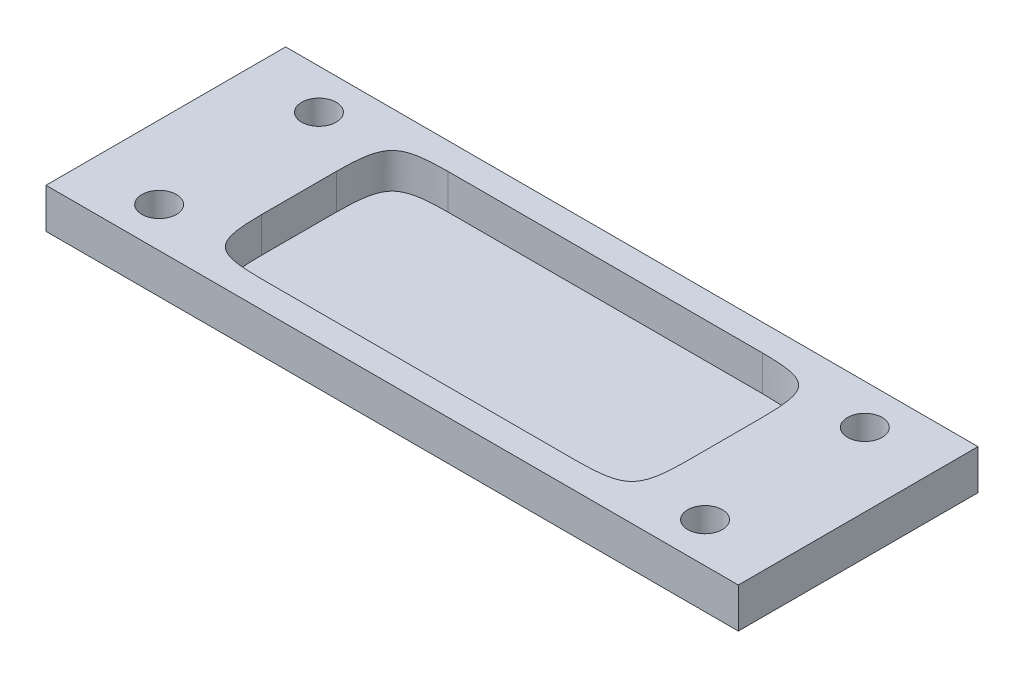
ISO-10303-21;
HEADER;
FILE_DESCRIPTION(('STEP AP214'),'2;1');
FILE_NAME('part.step','',(''),(''),'','','');
FILE_SCHEMA(('AUTOMOTIVE_DESIGN { 1 0 10303 214 1 1 1 1 }'));
ENDSEC;
DATA;
#1=APPLICATION_CONTEXT('core data for automotive mechanical design processes');
#2=APPLICATION_PROTOCOL_DEFINITION('international standard','automotive_design',2000,#1);
#3=PRODUCT_CONTEXT('',#1,'mechanical');
#4=PRODUCT('Part','Part','',(#3));
#5=PRODUCT_RELATED_PRODUCT_CATEGORY('part','',(#4));
#6=PRODUCT_DEFINITION_FORMATION('','',#4);
#7=PRODUCT_DEFINITION_CONTEXT('part definition',#1,'design');
#8=PRODUCT_DEFINITION('design','',#6,#7);
#9=PRODUCT_DEFINITION_SHAPE('','',#8);
#10=(LENGTH_UNIT() NAMED_UNIT(*) SI_UNIT(.MILLI.,.METRE.));
#11=(NAMED_UNIT(*) PLANE_ANGLE_UNIT() SI_UNIT($,.RADIAN.));
#12=(NAMED_UNIT(*) SI_UNIT($,.STERADIAN.) SOLID_ANGLE_UNIT());
#13=UNCERTAINTY_MEASURE_WITH_UNIT(LENGTH_MEASURE(1.E-05),#10,'distance_accuracy_value','');
#14=(GEOMETRIC_REPRESENTATION_CONTEXT(3) GLOBAL_UNCERTAINTY_ASSIGNED_CONTEXT((#13)) GLOBAL_UNIT_ASSIGNED_CONTEXT((#10,
#11,#12)) REPRESENTATION_CONTEXT('',''));
#15=CARTESIAN_POINT('',(0.,0.,0.));
#16=DIRECTION('',(0.,0.,1.));
#17=DIRECTION('',(1.,0.,0.));
#18=AXIS2_PLACEMENT_3D('',#15,#16,#17);
#19=CARTESIAN_POINT('',(26.0000000000002,3.,-8.9999999999999));
#20=DIRECTION('',(-1.,0.,0.));
#21=DIRECTION('',(0.,0.,1.));
#22=AXIS2_PLACEMENT_3D('',#19,#20,#21);
#23=PLANE('',#22);
#24=DIRECTION('',(0.,0.,-1.));
#25=VECTOR('',#24,1.);
#26=CARTESIAN_POINT('',(26.0000000000002,0.,-8.9999999999999));
#27=LINE('',#26,#25);
#28=CARTESIAN_POINT('',(26.0000000000002,0.,9.00000000000012));
#29=VERTEX_POINT('',#28);
#30=CARTESIAN_POINT('',(26.0000000000002,0.,-8.9999999999999));
#31=VERTEX_POINT('',#30);
#32=EDGE_CURVE('E170',#29,#31,#27,.T.);
#33=ORIENTED_EDGE('',*,*,#32,.T.);
#34=DIRECTION('',(0.,-1.,0.));
#35=VECTOR('',#34,1.);
#36=CARTESIAN_POINT('',(26.0000000000002,3.,-8.9999999999999));
#37=LINE('',#36,#35);
#38=CARTESIAN_POINT('',(26.0000000000002,3.,-8.9999999999999));
#39=VERTEX_POINT('',#38);
#40=EDGE_CURVE('E149',#39,#31,#37,.T.);
#41=ORIENTED_EDGE('',*,*,#40,.F.);
#42=DIRECTION('',(0.,0.,-1.));
#43=VECTOR('',#42,1.);
#44=CARTESIAN_POINT('',(26.0000000000002,3.,-8.9999999999999));
#45=LINE('',#44,#43);
#46=CARTESIAN_POINT('',(26.0000000000002,3.,9.00000000000012));
#47=VERTEX_POINT('',#46);
#48=EDGE_CURVE('E157',#47,#39,#45,.T.);
#49=ORIENTED_EDGE('',*,*,#48,.F.);
#50=DIRECTION('',(0.,-1.,0.));
#51=VECTOR('',#50,1.);
#52=CARTESIAN_POINT('',(26.0000000000002,3.,9.00000000000012));
#53=LINE('',#52,#51);
#54=EDGE_CURVE('E200',#47,#29,#53,.T.);
#55=ORIENTED_EDGE('',*,*,#54,.T.);
#56=EDGE_LOOP('',(#33,#41,#49,#55));
#57=FACE_BOUND('',#56,.T.);
#58=ADVANCED_FACE('F48',(#57),#23,.F.);
#59=CARTESIAN_POINT('',(-25.9999999999998,3.,-8.9999999999999));
#60=DIRECTION('',(0.,0.,1.));
#61=DIRECTION('',(1.,0.,0.));
#62=AXIS2_PLACEMENT_3D('',#59,#60,#61);
#63=PLANE('',#62);
#64=DIRECTION('',(-1.,0.,0.));
#65=VECTOR('',#64,1.);
#66=CARTESIAN_POINT('',(-25.9999999999998,0.,-8.9999999999999));
#67=LINE('',#66,#65);
#68=CARTESIAN_POINT('',(-25.9999999999998,0.,-8.9999999999999));
#69=VERTEX_POINT('',#68);
#70=EDGE_CURVE('E203',#31,#69,#67,.T.);
#71=ORIENTED_EDGE('',*,*,#70,.T.);
#72=DIRECTION('',(0.,-1.,0.));
#73=VECTOR('',#72,1.);
#74=CARTESIAN_POINT('',(-25.9999999999998,3.,-8.9999999999999));
#75=LINE('',#74,#73);
#76=CARTESIAN_POINT('',(-25.9999999999998,3.,-8.9999999999999));
#77=VERTEX_POINT('',#76);
#78=EDGE_CURVE('E152',#77,#69,#75,.T.);
#79=ORIENTED_EDGE('',*,*,#78,.F.);
#80=DIRECTION('',(-1.,0.,0.));
#81=VECTOR('',#80,1.);
#82=CARTESIAN_POINT('',(-25.9999999999998,3.,-8.9999999999999));
#83=LINE('',#82,#81);
#84=EDGE_CURVE('E145',#39,#77,#83,.T.);
#85=ORIENTED_EDGE('',*,*,#84,.F.);
#86=ORIENTED_EDGE('',*,*,#40,.T.);
#87=EDGE_LOOP('',(#71,#79,#85,#86));
#88=FACE_BOUND('',#87,.T.);
#89=ADVANCED_FACE('F147',(#88),#63,.F.);
#90=CARTESIAN_POINT('',(-25.9999999999998,3.,-8.9999999999999));
#91=DIRECTION('',(1.,0.,0.));
#92=DIRECTION('',(0.,0.,-1.));
#93=AXIS2_PLACEMENT_3D('',#90,#91,#92);
#94=PLANE('',#93);
#95=DIRECTION('',(0.,0.,1.));
#96=VECTOR('',#95,1.);
#97=CARTESIAN_POINT('',(-25.9999999999998,0.,-8.9999999999999));
#98=LINE('',#97,#96);
#99=CARTESIAN_POINT('',(-25.9999999999998,0.,9.00000000000012));
#100=VERTEX_POINT('',#99);
#101=EDGE_CURVE('E206',#69,#100,#98,.T.);
#102=ORIENTED_EDGE('',*,*,#101,.T.);
#103=DIRECTION('',(0.,-1.,0.));
#104=VECTOR('',#103,1.);
#105=CARTESIAN_POINT('',(-25.9999999999998,3.,9.00000000000012));
#106=LINE('',#105,#104);
#107=CARTESIAN_POINT('',(-25.9999999999998,3.,9.00000000000012));
#108=VERTEX_POINT('',#107);
#109=EDGE_CURVE('E177',#108,#100,#106,.T.);
#110=ORIENTED_EDGE('',*,*,#109,.F.);
#111=DIRECTION('',(0.,0.,1.));
#112=VECTOR('',#111,1.);
#113=CARTESIAN_POINT('',(-25.9999999999998,3.,-8.9999999999999));
#114=LINE('',#113,#112);
#115=EDGE_CURVE('E156',#77,#108,#114,.T.);
#116=ORIENTED_EDGE('',*,*,#115,.F.);
#117=ORIENTED_EDGE('',*,*,#78,.T.);
#118=EDGE_LOOP('',(#102,#110,#116,#117));
#119=FACE_BOUND('',#118,.T.);
#120=ADVANCED_FACE('F222',(#119),#94,.F.);
#121=CARTESIAN_POINT('',(-25.9999999999998,3.,9.00000000000012));
#122=DIRECTION('',(0.,0.,-1.));
#123=DIRECTION('',(-1.,0.,0.));
#124=AXIS2_PLACEMENT_3D('',#121,#122,#123);
#125=PLANE('',#124);
#126=DIRECTION('',(1.,0.,0.));
#127=VECTOR('',#126,1.);
#128=CARTESIAN_POINT('',(-25.9999999999998,0.,9.00000000000012));
#129=LINE('',#128,#127);
#130=EDGE_CURVE('E167',#100,#29,#129,.T.);
#131=ORIENTED_EDGE('',*,*,#130,.T.);
#132=ORIENTED_EDGE('',*,*,#54,.F.);
#133=DIRECTION('',(1.,0.,0.));
#134=VECTOR('',#133,1.);
#135=CARTESIAN_POINT('',(-25.9999999999998,3.,9.00000000000012));
#136=LINE('',#135,#134);
#137=EDGE_CURVE('E162',#108,#47,#136,.T.);
#138=ORIENTED_EDGE('',*,*,#137,.F.);
#139=ORIENTED_EDGE('',*,*,#109,.T.);
#140=EDGE_LOOP('',(#131,#132,#138,#139));
#141=FACE_BOUND('',#140,.T.);
#142=ADVANCED_FACE('F217',(#141),#125,.F.);
#143=CARTESIAN_POINT('',(0.,3.,0.));
#144=DIRECTION('',(0.,1.,0.));
#145=DIRECTION('',(0.,0.,1.));
#146=AXIS2_PLACEMENT_3D('',#143,#144,#145);
#147=PLANE('',#146);
#148=CARTESIAN_POINT('',(-20.4999999999998,3.,-5.99999999999988));
#149=DIRECTION('',(0.,1.,0.));
#150=DIRECTION('',(0.,0.,1.));
#151=AXIS2_PLACEMENT_3D('',#148,#149,#150);
#152=CIRCLE('',#151,1.3);
#153=CARTESIAN_POINT('',(-20.4999999999998,3.,-4.69999999999988));
#154=VERTEX_POINT('',#153);
#155=EDGE_CURVE('E544',#154,#154,#152,.T.);
#156=ORIENTED_EDGE('',*,*,#155,.F.);
#157=EDGE_LOOP('',(#156));
#158=FACE_BOUND('',#157,.T.);
#159=CARTESIAN_POINT('',(-20.4999999999998,3.,6.00000000000012));
#160=DIRECTION('',(0.,1.,0.));
#161=DIRECTION('',(0.,0.,1.));
#162=AXIS2_PLACEMENT_3D('',#159,#160,#161);
#163=CIRCLE('',#162,1.3);
#164=CARTESIAN_POINT('',(-20.4999999999998,3.,7.30000000000012));
#165=VERTEX_POINT('',#164);
#166=EDGE_CURVE('E548',#165,#165,#163,.T.);
#167=ORIENTED_EDGE('',*,*,#166,.F.);
#168=EDGE_LOOP('',(#167));
#169=FACE_BOUND('',#168,.T.);
#170=CARTESIAN_POINT('',(20.5000000000002,3.,-5.99999999999988));
#171=DIRECTION('',(0.,1.,0.));
#172=DIRECTION('',(0.,0.,1.));
#173=AXIS2_PLACEMENT_3D('',#170,#171,#172);
#174=CIRCLE('',#173,1.3);
#175=CARTESIAN_POINT('',(20.5000000000002,3.,-4.69999999999988));
#176=VERTEX_POINT('',#175);
#177=EDGE_CURVE('E552',#176,#176,#174,.T.);
#178=ORIENTED_EDGE('',*,*,#177,.F.);
#179=EDGE_LOOP('',(#178));
#180=FACE_BOUND('',#179,.T.);
#181=CARTESIAN_POINT('',(20.5000000000002,3.,6.00000000000012));
#182=DIRECTION('',(0.,1.,0.));
#183=DIRECTION('',(0.,0.,1.));
#184=AXIS2_PLACEMENT_3D('',#181,#182,#183);
#185=CIRCLE('',#184,1.3);
#186=CARTESIAN_POINT('',(20.5000000000002,3.,7.30000000000012));
#187=VERTEX_POINT('',#186);
#188=EDGE_CURVE('E555',#187,#187,#185,.T.);
#189=ORIENTED_EDGE('',*,*,#188,.F.);
#190=EDGE_LOOP('',(#189));
#191=FACE_BOUND('',#190,.T.);
#192=DIRECTION('',(0.,0.,-1.));
#193=VECTOR('',#192,1.);
#194=CARTESIAN_POINT('',(16.,3.,-7.));
#195=LINE('',#194,#193);
#196=CARTESIAN_POINT('',(16.,3.,2.8));
#197=VERTEX_POINT('',#196);
#198=CARTESIAN_POINT('',(16.,3.,-2.8));
#199=VERTEX_POINT('',#198);
#200=EDGE_CURVE('E454',#197,#199,#195,.T.);
#201=ORIENTED_EDGE('',*,*,#200,.F.);
#202=CARTESIAN_POINT('',(11.8,3.,7.));
#203=CARTESIAN_POINT('',(16.,3.,7.));
#204=CARTESIAN_POINT('',(16.,3.,2.8));
#205=(BOUNDED_CURVE() B_SPLINE_CURVE(2,(#202,#203,#204),.UNSPECIFIED.,.F.,
.F.) B_SPLINE_CURVE_WITH_KNOTS((3,3),(0.,1.),
.UNSPECIFIED.) CURVE() GEOMETRIC_REPRESENTATION_ITEM() RATIONAL_B_SPLINE_CURVE((1.,
1.85714285714286,1.)) REPRESENTATION_ITEM(''));
#206=CARTESIAN_POINT('',(11.8,3.,7.));
#207=VERTEX_POINT('',#206);
#208=EDGE_CURVE('E12',#197,#207,#205,.F.);
#209=ORIENTED_EDGE('',*,*,#208,.T.);
#210=DIRECTION('',(1.,0.,0.));
#211=VECTOR('',#210,1.);
#212=CARTESIAN_POINT('',(-16.,3.,7.));
#213=LINE('',#212,#211);
#214=CARTESIAN_POINT('',(-11.8,3.,7.));
#215=VERTEX_POINT('',#214);
#216=EDGE_CURVE('E181',#215,#207,#213,.T.);
#217=ORIENTED_EDGE('',*,*,#216,.F.);
#218=CARTESIAN_POINT('',(-16.,3.,2.8));
#219=CARTESIAN_POINT('',(-16.,3.,7.));
#220=CARTESIAN_POINT('',(-11.8,3.,7.));
#221=(BOUNDED_CURVE() B_SPLINE_CURVE(2,(#218,#219,#220),.UNSPECIFIED.,.F.,
.F.) B_SPLINE_CURVE_WITH_KNOTS((3,3),(0.,1.),
.UNSPECIFIED.) CURVE() GEOMETRIC_REPRESENTATION_ITEM() RATIONAL_B_SPLINE_CURVE((1.,
1.85714285714286,1.)) REPRESENTATION_ITEM(''));
#222=CARTESIAN_POINT('',(-16.,3.,2.8));
#223=VERTEX_POINT('',#222);
#224=EDGE_CURVE('E496',#215,#223,#221,.F.);
#225=ORIENTED_EDGE('',*,*,#224,.T.);
#226=DIRECTION('',(0.,0.,1.));
#227=VECTOR('',#226,1.);
#228=CARTESIAN_POINT('',(-16.,3.,-7.));
#229=LINE('',#228,#227);
#230=CARTESIAN_POINT('',(-16.,3.,-2.8));
#231=VERTEX_POINT('',#230);
#232=EDGE_CURVE('E187',#231,#223,#229,.T.);
#233=ORIENTED_EDGE('',*,*,#232,.F.);
#234=CARTESIAN_POINT('',(-11.8,3.,-7.));
#235=CARTESIAN_POINT('',(-16.,3.,-7.));
#236=CARTESIAN_POINT('',(-16.,3.,-2.8));
#237=(BOUNDED_CURVE() B_SPLINE_CURVE(2,(#234,#235,#236),.UNSPECIFIED.,.F.,
.F.) B_SPLINE_CURVE_WITH_KNOTS((3,3),(0.,1.),
.UNSPECIFIED.) CURVE() GEOMETRIC_REPRESENTATION_ITEM() RATIONAL_B_SPLINE_CURVE((1.,
1.85714285714286,1.)) REPRESENTATION_ITEM(''));
#238=CARTESIAN_POINT('',(-11.8,3.,-7.));
#239=VERTEX_POINT('',#238);
#240=EDGE_CURVE('E294',#231,#239,#237,.F.);
#241=ORIENTED_EDGE('',*,*,#240,.T.);
#242=DIRECTION('',(-1.,0.,0.));
#243=VECTOR('',#242,1.);
#244=CARTESIAN_POINT('',(-16.,3.,-7.));
#245=LINE('',#244,#243);
#246=CARTESIAN_POINT('',(11.8,3.,-7.));
#247=VERTEX_POINT('',#246);
#248=EDGE_CURVE('E458',#247,#239,#245,.T.);
#249=ORIENTED_EDGE('',*,*,#248,.F.);
#250=CARTESIAN_POINT('',(16.,3.,-2.8));
#251=CARTESIAN_POINT('',(16.,3.,-7.));
#252=CARTESIAN_POINT('',(11.8,3.,-7.));
#253=(BOUNDED_CURVE() B_SPLINE_CURVE(2,(#250,#251,#252),.UNSPECIFIED.,.F.,
.F.) B_SPLINE_CURVE_WITH_KNOTS((3,3),(0.,1.),
.UNSPECIFIED.) CURVE() GEOMETRIC_REPRESENTATION_ITEM() RATIONAL_B_SPLINE_CURVE((1.,
1.85714285714286,1.)) REPRESENTATION_ITEM(''));
#254=EDGE_CURVE('E63',#247,#199,#253,.F.);
#255=ORIENTED_EDGE('',*,*,#254,.T.);
#256=EDGE_LOOP('',(#201,#209,#217,#225,#233,#241,#249,#255));
#257=FACE_BOUND('',#256,.T.);
#258=ORIENTED_EDGE('',*,*,#48,.T.);
#259=ORIENTED_EDGE('',*,*,#84,.T.);
#260=ORIENTED_EDGE('',*,*,#115,.T.);
#261=ORIENTED_EDGE('',*,*,#137,.T.);
#262=EDGE_LOOP('',(#258,#259,#260,#261));
#263=FACE_BOUND('',#262,.T.);
#264=ADVANCED_FACE('F160',(#158,#169,#180,#191,#257,#263),#147,.T.);
#265=CARTESIAN_POINT('',(0.,0.,0.));
#266=DIRECTION('',(0.,1.,0.));
#267=DIRECTION('',(0.,0.,1.));
#268=AXIS2_PLACEMENT_3D('',#265,#266,#267);
#269=PLANE('',#268);
#270=CARTESIAN_POINT('',(-20.4999999999998,0.,-5.99999999999988));
#271=DIRECTION('',(0.,1.,0.));
#272=DIRECTION('',(0.,0.,1.));
#273=AXIS2_PLACEMENT_3D('',#270,#271,#272);
#274=CIRCLE('',#273,1.3);
#275=CARTESIAN_POINT('',(-20.4999999999998,0.,-4.69999999999988));
#276=VERTEX_POINT('',#275);
#277=EDGE_CURVE('E814',#276,#276,#274,.T.);
#278=ORIENTED_EDGE('',*,*,#277,.T.);
#279=EDGE_LOOP('',(#278));
#280=FACE_BOUND('',#279,.T.);
#281=CARTESIAN_POINT('',(-20.4999999999998,0.,6.00000000000012));
#282=DIRECTION('',(0.,1.,0.));
#283=DIRECTION('',(0.,0.,1.));
#284=AXIS2_PLACEMENT_3D('',#281,#282,#283);
#285=CIRCLE('',#284,1.3);
#286=CARTESIAN_POINT('',(-20.4999999999998,0.,7.30000000000012));
#287=VERTEX_POINT('',#286);
#288=EDGE_CURVE('E822',#287,#287,#285,.T.);
#289=ORIENTED_EDGE('',*,*,#288,.T.);
#290=EDGE_LOOP('',(#289));
#291=FACE_BOUND('',#290,.T.);
#292=CARTESIAN_POINT('',(20.5000000000002,0.,-5.99999999999988));
#293=DIRECTION('',(0.,1.,0.));
#294=DIRECTION('',(0.,0.,1.));
#295=AXIS2_PLACEMENT_3D('',#292,#293,#294);
#296=CIRCLE('',#295,1.3);
#297=CARTESIAN_POINT('',(20.5000000000002,0.,-4.69999999999988));
#298=VERTEX_POINT('',#297);
#299=EDGE_CURVE('E558',#298,#298,#296,.T.);
#300=ORIENTED_EDGE('',*,*,#299,.T.);
#301=EDGE_LOOP('',(#300));
#302=FACE_BOUND('',#301,.T.);
#303=CARTESIAN_POINT('',(20.5000000000002,0.,6.00000000000012));
#304=DIRECTION('',(0.,1.,0.));
#305=DIRECTION('',(0.,0.,1.));
#306=AXIS2_PLACEMENT_3D('',#303,#304,#305);
#307=CIRCLE('',#306,1.3);
#308=CARTESIAN_POINT('',(20.5000000000002,0.,7.30000000000012));
#309=VERTEX_POINT('',#308);
#310=EDGE_CURVE('E459',#309,#309,#307,.T.);
#311=ORIENTED_EDGE('',*,*,#310,.T.);
#312=EDGE_LOOP('',(#311));
#313=FACE_BOUND('',#312,.T.);
#314=ORIENTED_EDGE('',*,*,#32,.F.);
#315=ORIENTED_EDGE('',*,*,#130,.F.);
#316=ORIENTED_EDGE('',*,*,#101,.F.);
#317=ORIENTED_EDGE('',*,*,#70,.F.);
#318=EDGE_LOOP('',(#314,#315,#316,#317));
#319=FACE_BOUND('',#318,.T.);
#320=ADVANCED_FACE('F221',(#280,#291,#302,#313,#319),#269,.F.);
#321=CARTESIAN_POINT('',(16.,0.35,-7.));
#322=DIRECTION('',(1.,0.,0.));
#323=DIRECTION('',(0.,0.,-1.));
#324=AXIS2_PLACEMENT_3D('',#321,#322,#323);
#325=PLANE('',#324);
#326=ORIENTED_EDGE('',*,*,#200,.T.);
#327=CARTESIAN_POINT('',(16.,0.2175,-2.8));
#328=CARTESIAN_POINT('',(16.,1.18916666666667,-2.8));
#329=CARTESIAN_POINT('',(16.,2.16083333333333,-2.8));
#330=CARTESIAN_POINT('',(16.,3.1325,-2.8));
#331=(BOUNDED_CURVE() B_SPLINE_CURVE(3,(#327,#328,#329,#330),.UNSPECIFIED.,.F.,
.F.) B_SPLINE_CURVE_WITH_KNOTS((4,4),(-0.0027825,0.0001325),
.UNSPECIFIED.) CURVE() GEOMETRIC_REPRESENTATION_ITEM() RATIONAL_B_SPLINE_CURVE((1.,1.,1.,1.)) REPRESENTATION_ITEM(''));
#332=CARTESIAN_POINT('',(16.,0.35,-2.8));
#333=VERTEX_POINT('',#332);
#334=EDGE_CURVE('E379',#199,#333,#331,.F.);
#335=ORIENTED_EDGE('',*,*,#334,.T.);
#336=DIRECTION('',(0.,0.,-1.));
#337=VECTOR('',#336,1.);
#338=CARTESIAN_POINT('',(16.,0.35,-7.));
#339=LINE('',#338,#337);
#340=CARTESIAN_POINT('',(16.,0.35,2.8));
#341=VERTEX_POINT('',#340);
#342=EDGE_CURVE('E186',#341,#333,#339,.T.);
#343=ORIENTED_EDGE('',*,*,#342,.F.);
#344=CARTESIAN_POINT('',(16.,3.1325,2.8));
#345=CARTESIAN_POINT('',(16.,2.16083333333333,2.8));
#346=CARTESIAN_POINT('',(16.,1.18916666666667,2.8));
#347=CARTESIAN_POINT('',(16.,0.2175,2.8));
#348=(BOUNDED_CURVE() B_SPLINE_CURVE(3,(#344,#345,#346,#347),.UNSPECIFIED.,.F.,
.F.) B_SPLINE_CURVE_WITH_KNOTS((4,4),(-0.0027825,0.0001325),
.UNSPECIFIED.) CURVE() GEOMETRIC_REPRESENTATION_ITEM() RATIONAL_B_SPLINE_CURVE((1.,1.,1.,1.)) REPRESENTATION_ITEM(''));
#349=EDGE_CURVE('E398',#341,#197,#348,.F.);
#350=ORIENTED_EDGE('',*,*,#349,.T.);
#351=EDGE_LOOP('',(#326,#335,#343,#350));
#352=FACE_BOUND('',#351,.T.);
#353=ADVANCED_FACE('F471',(#352),#325,.F.);
#354=CARTESIAN_POINT('',(-16.,0.35,7.));
#355=DIRECTION('',(0.,0.,1.));
#356=DIRECTION('',(1.,0.,0.));
#357=AXIS2_PLACEMENT_3D('',#354,#355,#356);
#358=PLANE('',#357);
#359=DIRECTION('',(1.,0.,0.));
#360=VECTOR('',#359,1.);
#361=CARTESIAN_POINT('',(-16.,0.35,7.));
#362=LINE('',#361,#360);
#363=CARTESIAN_POINT('',(-11.8,0.35,7.));
#364=VERTEX_POINT('',#363);
#365=CARTESIAN_POINT('',(11.8,0.35,7.));
#366=VERTEX_POINT('',#365);
#367=EDGE_CURVE('E188',#364,#366,#362,.T.);
#368=ORIENTED_EDGE('',*,*,#367,.F.);
#369=CARTESIAN_POINT('',(-11.8,3.1325,7.));
#370=CARTESIAN_POINT('',(-11.8,2.16083333333333,7.));
#371=CARTESIAN_POINT('',(-11.8,1.18916666666667,7.));
#372=CARTESIAN_POINT('',(-11.8,0.2175,7.));
#373=(BOUNDED_CURVE() B_SPLINE_CURVE(3,(#369,#370,#371,#372),.UNSPECIFIED.,.F.,
.F.) B_SPLINE_CURVE_WITH_KNOTS((4,4),(-0.0027825,0.0001325),
.UNSPECIFIED.) CURVE() GEOMETRIC_REPRESENTATION_ITEM() RATIONAL_B_SPLINE_CURVE((1.,1.,1.,1.)) REPRESENTATION_ITEM(''));
#374=EDGE_CURVE('E176',#364,#215,#373,.F.);
#375=ORIENTED_EDGE('',*,*,#374,.T.);
#376=ORIENTED_EDGE('',*,*,#216,.T.);
#377=CARTESIAN_POINT('',(11.8,0.2175,7.));
#378=CARTESIAN_POINT('',(11.8,1.18916666666667,7.));
#379=CARTESIAN_POINT('',(11.8,2.16083333333333,7.));
#380=CARTESIAN_POINT('',(11.8,3.1325,7.));
#381=(BOUNDED_CURVE() B_SPLINE_CURVE(3,(#377,#378,#379,#380),.UNSPECIFIED.,.F.,
.F.) B_SPLINE_CURVE_WITH_KNOTS((4,4),(-0.0027825,0.0001325),
.UNSPECIFIED.) CURVE() GEOMETRIC_REPRESENTATION_ITEM() RATIONAL_B_SPLINE_CURVE((1.,1.,1.,1.)) REPRESENTATION_ITEM(''));
#382=EDGE_CURVE('E172',#207,#366,#381,.F.);
#383=ORIENTED_EDGE('',*,*,#382,.T.);
#384=EDGE_LOOP('',(#368,#375,#376,#383));
#385=FACE_BOUND('',#384,.T.);
#386=ADVANCED_FACE('F419',(#385),#358,.F.);
#387=CARTESIAN_POINT('',(-16.,0.35,-7.));
#388=DIRECTION('',(-1.,0.,0.));
#389=DIRECTION('',(0.,0.,1.));
#390=AXIS2_PLACEMENT_3D('',#387,#388,#389);
#391=PLANE('',#390);
#392=ORIENTED_EDGE('',*,*,#232,.T.);
#393=CARTESIAN_POINT('',(-16.,0.2175,2.8));
#394=CARTESIAN_POINT('',(-16.,1.18916666666667,2.8));
#395=CARTESIAN_POINT('',(-16.,2.16083333333333,2.8));
#396=CARTESIAN_POINT('',(-16.,3.1325,2.8));
#397=(BOUNDED_CURVE() B_SPLINE_CURVE(3,(#393,#394,#395,#396),.UNSPECIFIED.,.F.,
.F.) B_SPLINE_CURVE_WITH_KNOTS((4,4),(-0.0027825,0.0001325),
.UNSPECIFIED.) CURVE() GEOMETRIC_REPRESENTATION_ITEM() RATIONAL_B_SPLINE_CURVE((1.,1.,1.,1.)) REPRESENTATION_ITEM(''));
#398=CARTESIAN_POINT('',(-16.,0.35,2.8));
#399=VERTEX_POINT('',#398);
#400=EDGE_CURVE('E281',#223,#399,#397,.F.);
#401=ORIENTED_EDGE('',*,*,#400,.T.);
#402=DIRECTION('',(0.,0.,1.));
#403=VECTOR('',#402,1.);
#404=CARTESIAN_POINT('',(-16.,0.35,-7.));
#405=LINE('',#404,#403);
#406=CARTESIAN_POINT('',(-16.,0.35,-2.8));
#407=VERTEX_POINT('',#406);
#408=EDGE_CURVE('E432',#407,#399,#405,.T.);
#409=ORIENTED_EDGE('',*,*,#408,.F.);
#410=CARTESIAN_POINT('',(-16.,3.1325,-2.8));
#411=CARTESIAN_POINT('',(-16.,2.16083333333333,-2.8));
#412=CARTESIAN_POINT('',(-16.,1.18916666666667,-2.8));
#413=CARTESIAN_POINT('',(-16.,0.2175,-2.8));
#414=(BOUNDED_CURVE() B_SPLINE_CURVE(3,(#410,#411,#412,#413),.UNSPECIFIED.,.F.,
.F.) B_SPLINE_CURVE_WITH_KNOTS((4,4),(-0.0027825,0.0001325),
.UNSPECIFIED.) CURVE() GEOMETRIC_REPRESENTATION_ITEM() RATIONAL_B_SPLINE_CURVE((1.,1.,1.,1.)) REPRESENTATION_ITEM(''));
#415=EDGE_CURVE('E306',#407,#231,#414,.F.);
#416=ORIENTED_EDGE('',*,*,#415,.T.);
#417=EDGE_LOOP('',(#392,#401,#409,#416));
#418=FACE_BOUND('',#417,.T.);
#419=ADVANCED_FACE('F636',(#418),#391,.F.);
#420=CARTESIAN_POINT('',(-16.,0.35,-7.));
#421=DIRECTION('',(0.,0.,-1.));
#422=DIRECTION('',(-1.,0.,0.));
#423=AXIS2_PLACEMENT_3D('',#420,#421,#422);
#424=PLANE('',#423);
#425=ORIENTED_EDGE('',*,*,#248,.T.);
#426=CARTESIAN_POINT('',(-11.8,0.2175,-7.));
#427=CARTESIAN_POINT('',(-11.8,1.18916666666667,-7.));
#428=CARTESIAN_POINT('',(-11.8,2.16083333333333,-7.));
#429=CARTESIAN_POINT('',(-11.8,3.1325,-7.));
#430=(BOUNDED_CURVE() B_SPLINE_CURVE(3,(#426,#427,#428,#429),.UNSPECIFIED.,.F.,
.F.) B_SPLINE_CURVE_WITH_KNOTS((4,4),(-0.0027825,0.0001325),
.UNSPECIFIED.) CURVE() GEOMETRIC_REPRESENTATION_ITEM() RATIONAL_B_SPLINE_CURVE((1.,1.,1.,1.)) REPRESENTATION_ITEM(''));
#431=CARTESIAN_POINT('',(-11.8,0.35,-7.));
#432=VERTEX_POINT('',#431);
#433=EDGE_CURVE('E326',#239,#432,#430,.F.);
#434=ORIENTED_EDGE('',*,*,#433,.T.);
#435=DIRECTION('',(-1.,0.,0.));
#436=VECTOR('',#435,1.);
#437=CARTESIAN_POINT('',(-16.,0.35,-7.));
#438=LINE('',#437,#436);
#439=CARTESIAN_POINT('',(11.8,0.35,-7.));
#440=VERTEX_POINT('',#439);
#441=EDGE_CURVE('E434',#440,#432,#438,.T.);
#442=ORIENTED_EDGE('',*,*,#441,.F.);
#443=CARTESIAN_POINT('',(11.8,3.1325,-7.));
#444=CARTESIAN_POINT('',(11.8,2.16083333333333,-7.));
#445=CARTESIAN_POINT('',(11.8,1.18916666666667,-7.));
#446=CARTESIAN_POINT('',(11.8,0.2175,-7.));
#447=(BOUNDED_CURVE() B_SPLINE_CURVE(3,(#443,#444,#445,#446),.UNSPECIFIED.,.F.,
.F.) B_SPLINE_CURVE_WITH_KNOTS((4,4),(-0.0027825,0.0001325),
.UNSPECIFIED.) CURVE() GEOMETRIC_REPRESENTATION_ITEM() RATIONAL_B_SPLINE_CURVE((1.,1.,1.,1.)) REPRESENTATION_ITEM(''));
#448=EDGE_CURVE('E620',#440,#247,#447,.F.);
#449=ORIENTED_EDGE('',*,*,#448,.T.);
#450=EDGE_LOOP('',(#425,#434,#442,#449));
#451=FACE_BOUND('',#450,.T.);
#452=ADVANCED_FACE('F480',(#451),#424,.F.);
#453=CARTESIAN_POINT('',(0.,0.35,0.));
#454=DIRECTION('',(0.,1.,0.));
#455=DIRECTION('',(0.,0.,1.));
#456=AXIS2_PLACEMENT_3D('',#453,#454,#455);
#457=PLANE('',#456);
#458=ORIENTED_EDGE('',*,*,#408,.T.);
#459=CARTESIAN_POINT('',(-11.8,0.35,7.));
#460=CARTESIAN_POINT('',(-16.,0.35,7.));
#461=CARTESIAN_POINT('',(-16.,0.35,2.8));
#462=(BOUNDED_CURVE() B_SPLINE_CURVE(2,(#459,#460,#461),.UNSPECIFIED.,.F.,
.F.) B_SPLINE_CURVE_WITH_KNOTS((3,3),(0.,1.),
.UNSPECIFIED.) CURVE() GEOMETRIC_REPRESENTATION_ITEM() RATIONAL_B_SPLINE_CURVE((1.,
1.85714285714286,1.)) REPRESENTATION_ITEM(''));
#463=EDGE_CURVE('E429',#399,#364,#462,.F.);
#464=ORIENTED_EDGE('',*,*,#463,.T.);
#465=ORIENTED_EDGE('',*,*,#367,.T.);
#466=CARTESIAN_POINT('',(16.,0.35,2.8));
#467=CARTESIAN_POINT('',(16.,0.35,7.));
#468=CARTESIAN_POINT('',(11.8,0.35,7.));
#469=(BOUNDED_CURVE() B_SPLINE_CURVE(2,(#466,#467,#468),.UNSPECIFIED.,.F.,
.F.) B_SPLINE_CURVE_WITH_KNOTS((3,3),(0.,1.),
.UNSPECIFIED.) CURVE() GEOMETRIC_REPRESENTATION_ITEM() RATIONAL_B_SPLINE_CURVE((1.,
1.85714285714286,1.)) REPRESENTATION_ITEM(''));
#470=EDGE_CURVE('E408',#366,#341,#469,.F.);
#471=ORIENTED_EDGE('',*,*,#470,.T.);
#472=ORIENTED_EDGE('',*,*,#342,.T.);
#473=CARTESIAN_POINT('',(11.8,0.35,-7.));
#474=CARTESIAN_POINT('',(16.,0.35,-7.));
#475=CARTESIAN_POINT('',(16.,0.35,-2.8));
#476=(BOUNDED_CURVE() B_SPLINE_CURVE(2,(#473,#474,#475),.UNSPECIFIED.,.F.,
.F.) B_SPLINE_CURVE_WITH_KNOTS((3,3),(0.,1.),
.UNSPECIFIED.) CURVE() GEOMETRIC_REPRESENTATION_ITEM() RATIONAL_B_SPLINE_CURVE((1.,
1.85714285714286,1.)) REPRESENTATION_ITEM(''));
#477=EDGE_CURVE('E629',#333,#440,#476,.F.);
#478=ORIENTED_EDGE('',*,*,#477,.T.);
#479=ORIENTED_EDGE('',*,*,#441,.T.);
#480=CARTESIAN_POINT('',(-16.,0.35,-2.8));
#481=CARTESIAN_POINT('',(-16.,0.35,-7.));
#482=CARTESIAN_POINT('',(-11.8,0.35,-7.));
#483=(BOUNDED_CURVE() B_SPLINE_CURVE(2,(#480,#481,#482),.UNSPECIFIED.,.F.,
.F.) B_SPLINE_CURVE_WITH_KNOTS((3,3),(0.,1.),
.UNSPECIFIED.) CURVE() GEOMETRIC_REPRESENTATION_ITEM() RATIONAL_B_SPLINE_CURVE((1.,
1.85714285714286,1.)) REPRESENTATION_ITEM(''));
#484=EDGE_CURVE('E316',#432,#407,#483,.F.);
#485=ORIENTED_EDGE('',*,*,#484,.T.);
#486=EDGE_LOOP('',(#458,#464,#465,#471,#472,#478,#479,#485));
#487=FACE_BOUND('',#486,.T.);
#488=ADVANCED_FACE('F247',(#487),#457,.T.);
#489=CARTESIAN_POINT('',(-16.,3.1325,2.8));
#490=CARTESIAN_POINT('',(-16.,2.16083333333333,2.8));
#491=CARTESIAN_POINT('',(-16.,1.18916666666667,2.8));
#492=CARTESIAN_POINT('',(-16.,0.2175,2.8));
#493=CARTESIAN_POINT('',(-16.,3.1325,7.));
#494=CARTESIAN_POINT('',(-16.,2.16083333333333,7.));
#495=CARTESIAN_POINT('',(-16.,1.18916666666667,7.));
#496=CARTESIAN_POINT('',(-16.,0.2175,7.));
#497=CARTESIAN_POINT('',(-11.8,3.1325,7.));
#498=CARTESIAN_POINT('',(-11.8,2.16083333333333,7.));
#499=CARTESIAN_POINT('',(-11.8,1.18916666666667,7.));
#500=CARTESIAN_POINT('',(-11.8,0.2175,7.));
#501=(BOUNDED_SURFACE() B_SPLINE_SURFACE(2,3,((#489,#490,#491,#492),(#493,#494,#495,#496),(#497,
#498,#499,#500)),.UNSPECIFIED.,.F.,.F.,.F.) B_SPLINE_SURFACE_WITH_KNOTS((3,3),(4,4),(0.,1.),
(-0.0027825,0.0001325),
.UNSPECIFIED.) GEOMETRIC_REPRESENTATION_ITEM() RATIONAL_B_SPLINE_SURFACE(((1.,1.,1.,1.),
(1.85714285714286,1.85714285714286,1.85714285714286,1.85714285714286),(1.,1.,1.,1.))) REPRESENTATION_ITEM('') SURFACE());
#502=ORIENTED_EDGE('',*,*,#463,.F.);
#503=ORIENTED_EDGE('',*,*,#400,.F.);
#504=ORIENTED_EDGE('',*,*,#224,.F.);
#505=ORIENTED_EDGE('',*,*,#374,.F.);
#506=EDGE_LOOP('',(#502,#503,#504,#505));
#507=FACE_BOUND('',#506,.T.);
#508=ADVANCED_FACE('F237',(#507),#501,.T.);
#509=CARTESIAN_POINT('',(-11.8,3.1325,-7.));
#510=CARTESIAN_POINT('',(-11.8,2.16083333333333,-7.));
#511=CARTESIAN_POINT('',(-11.8,1.18916666666667,-7.));
#512=CARTESIAN_POINT('',(-11.8,0.2175,-7.));
#513=CARTESIAN_POINT('',(-16.,3.1325,-7.));
#514=CARTESIAN_POINT('',(-16.,2.16083333333333,-7.));
#515=CARTESIAN_POINT('',(-16.,1.18916666666667,-7.));
#516=CARTESIAN_POINT('',(-16.,0.2175,-7.));
#517=CARTESIAN_POINT('',(-16.,3.1325,-2.8));
#518=CARTESIAN_POINT('',(-16.,2.16083333333333,-2.8));
#519=CARTESIAN_POINT('',(-16.,1.18916666666667,-2.8));
#520=CARTESIAN_POINT('',(-16.,0.2175,-2.8));
#521=(BOUNDED_SURFACE() B_SPLINE_SURFACE(2,3,((#509,#510,#511,#512),(#513,#514,#515,#516),(#517,
#518,#519,#520)),.UNSPECIFIED.,.F.,.F.,.F.) B_SPLINE_SURFACE_WITH_KNOTS((3,3),(4,4),(0.,1.),
(-0.0027825,0.0001325),
.UNSPECIFIED.) GEOMETRIC_REPRESENTATION_ITEM() RATIONAL_B_SPLINE_SURFACE(((1.,1.,1.,1.),
(1.85714285714286,1.85714285714286,1.85714285714286,1.85714285714286),(1.,1.,1.,1.))) REPRESENTATION_ITEM('') SURFACE());
#522=ORIENTED_EDGE('',*,*,#484,.F.);
#523=ORIENTED_EDGE('',*,*,#433,.F.);
#524=ORIENTED_EDGE('',*,*,#240,.F.);
#525=ORIENTED_EDGE('',*,*,#415,.F.);
#526=EDGE_LOOP('',(#522,#523,#524,#525));
#527=FACE_BOUND('',#526,.T.);
#528=ADVANCED_FACE('F246',(#527),#521,.T.);
#529=CARTESIAN_POINT('',(16.,3.1325,-2.8));
#530=CARTESIAN_POINT('',(16.,2.16083333333333,-2.8));
#531=CARTESIAN_POINT('',(16.,1.18916666666667,-2.8));
#532=CARTESIAN_POINT('',(16.,0.2175,-2.8));
#533=CARTESIAN_POINT('',(16.,3.1325,-7.));
#534=CARTESIAN_POINT('',(16.,2.16083333333333,-7.));
#535=CARTESIAN_POINT('',(16.,1.18916666666667,-7.));
#536=CARTESIAN_POINT('',(16.,0.2175,-7.));
#537=CARTESIAN_POINT('',(11.8,3.1325,-7.));
#538=CARTESIAN_POINT('',(11.8,2.16083333333333,-7.));
#539=CARTESIAN_POINT('',(11.8,1.18916666666667,-7.));
#540=CARTESIAN_POINT('',(11.8,0.2175,-7.));
#541=(BOUNDED_SURFACE() B_SPLINE_SURFACE(2,3,((#529,#530,#531,#532),(#533,#534,#535,#536),(#537,
#538,#539,#540)),.UNSPECIFIED.,.F.,.F.,.F.) B_SPLINE_SURFACE_WITH_KNOTS((3,3),(4,4),(0.,1.),
(-0.0027825,0.0001325),
.UNSPECIFIED.) GEOMETRIC_REPRESENTATION_ITEM() RATIONAL_B_SPLINE_SURFACE(((1.,1.,1.,1.),
(1.85714285714286,1.85714285714286,1.85714285714286,1.85714285714286),(1.,1.,1.,1.))) REPRESENTATION_ITEM('') SURFACE());
#542=ORIENTED_EDGE('',*,*,#477,.F.);
#543=ORIENTED_EDGE('',*,*,#334,.F.);
#544=ORIENTED_EDGE('',*,*,#254,.F.);
#545=ORIENTED_EDGE('',*,*,#448,.F.);
#546=EDGE_LOOP('',(#542,#543,#544,#545));
#547=FACE_BOUND('',#546,.T.);
#548=ADVANCED_FACE('F345',(#547),#541,.T.);
#549=CARTESIAN_POINT('',(11.8,3.1325,7.));
#550=CARTESIAN_POINT('',(11.8,2.16083333333333,7.));
#551=CARTESIAN_POINT('',(11.8,1.18916666666667,7.));
#552=CARTESIAN_POINT('',(11.8,0.2175,7.));
#553=CARTESIAN_POINT('',(16.,3.1325,7.));
#554=CARTESIAN_POINT('',(16.,2.16083333333333,7.));
#555=CARTESIAN_POINT('',(16.,1.18916666666667,7.));
#556=CARTESIAN_POINT('',(16.,0.2175,7.));
#557=CARTESIAN_POINT('',(16.,3.1325,2.8));
#558=CARTESIAN_POINT('',(16.,2.16083333333333,2.8));
#559=CARTESIAN_POINT('',(16.,1.18916666666667,2.8));
#560=CARTESIAN_POINT('',(16.,0.2175,2.8));
#561=(BOUNDED_SURFACE() B_SPLINE_SURFACE(2,3,((#549,#550,#551,#552),(#553,#554,#555,#556),(#557,
#558,#559,#560)),.UNSPECIFIED.,.F.,.F.,.F.) B_SPLINE_SURFACE_WITH_KNOTS((3,3),(4,4),(0.,1.),
(-0.0027825,0.0001325),
.UNSPECIFIED.) GEOMETRIC_REPRESENTATION_ITEM() RATIONAL_B_SPLINE_SURFACE(((1.,1.,1.,1.),
(1.85714285714286,1.85714285714286,1.85714285714286,1.85714285714286),(1.,1.,1.,1.))) REPRESENTATION_ITEM('') SURFACE());
#562=ORIENTED_EDGE('',*,*,#470,.F.);
#563=ORIENTED_EDGE('',*,*,#382,.F.);
#564=ORIENTED_EDGE('',*,*,#208,.F.);
#565=ORIENTED_EDGE('',*,*,#349,.F.);
#566=EDGE_LOOP('',(#562,#563,#564,#565));
#567=FACE_BOUND('',#566,.T.);
#568=ADVANCED_FACE('F51',(#567),#561,.T.);
#569=CARTESIAN_POINT('',(20.5000000000002,3.,6.00000000000012));
#570=DIRECTION('',(0.,1.,0.));
#571=DIRECTION('',(0.,0.,1.));
#572=AXIS2_PLACEMENT_3D('',#569,#570,#571);
#573=CYLINDRICAL_SURFACE('',#572,1.3);
#574=ORIENTED_EDGE('',*,*,#310,.F.);
#575=EDGE_LOOP('',(#574));
#576=FACE_BOUND('',#575,.T.);
#577=ORIENTED_EDGE('',*,*,#188,.T.);
#578=EDGE_LOOP('',(#577));
#579=FACE_BOUND('',#578,.T.);
#580=ADVANCED_FACE('F589',(#576,#579),#573,.F.);
#581=CARTESIAN_POINT('',(20.5000000000002,3.,-5.99999999999988));
#582=DIRECTION('',(0.,1.,0.));
#583=DIRECTION('',(0.,0.,1.));
#584=AXIS2_PLACEMENT_3D('',#581,#582,#583);
#585=CYLINDRICAL_SURFACE('',#584,1.3);
#586=ORIENTED_EDGE('',*,*,#299,.F.);
#587=EDGE_LOOP('',(#586));
#588=FACE_BOUND('',#587,.T.);
#589=ORIENTED_EDGE('',*,*,#177,.T.);
#590=EDGE_LOOP('',(#589));
#591=FACE_BOUND('',#590,.T.);
#592=ADVANCED_FACE('F676',(#588,#591),#585,.F.);
#593=CARTESIAN_POINT('',(-20.4999999999998,3.,6.00000000000012));
#594=DIRECTION('',(0.,1.,0.));
#595=DIRECTION('',(0.,0.,1.));
#596=AXIS2_PLACEMENT_3D('',#593,#594,#595);
#597=CYLINDRICAL_SURFACE('',#596,1.3);
#598=ORIENTED_EDGE('',*,*,#288,.F.);
#599=EDGE_LOOP('',(#598));
#600=FACE_BOUND('',#599,.T.);
#601=ORIENTED_EDGE('',*,*,#166,.T.);
#602=EDGE_LOOP('',(#601));
#603=FACE_BOUND('',#602,.T.);
#604=ADVANCED_FACE('F688',(#600,#603),#597,.F.);
#605=CARTESIAN_POINT('',(-20.4999999999998,3.,-5.99999999999988));
#606=DIRECTION('',(0.,1.,0.));
#607=DIRECTION('',(0.,0.,1.));
#608=AXIS2_PLACEMENT_3D('',#605,#606,#607);
#609=CYLINDRICAL_SURFACE('',#608,1.3);
#610=ORIENTED_EDGE('',*,*,#277,.F.);
#611=EDGE_LOOP('',(#610));
#612=FACE_BOUND('',#611,.T.);
#613=ORIENTED_EDGE('',*,*,#155,.T.);
#614=EDGE_LOOP('',(#613));
#615=FACE_BOUND('',#614,.T.);
#616=ADVANCED_FACE('F698',(#612,#615),#609,.F.);
#617=CLOSED_SHELL('',(#58,#89,#120,#142,#264,#320,#353,#386,#419,#452,#488,#508,#528,#548,#568,
#580,#592,#604,#616));
#618=MANIFOLD_SOLID_BREP('B2',#617);
#619=ADVANCED_BREP_SHAPE_REPRESENTATION('',(#18,#618),#14);
#620=SHAPE_DEFINITION_REPRESENTATION(#9,#619);
ENDSEC;
END-ISO-10303-21;
